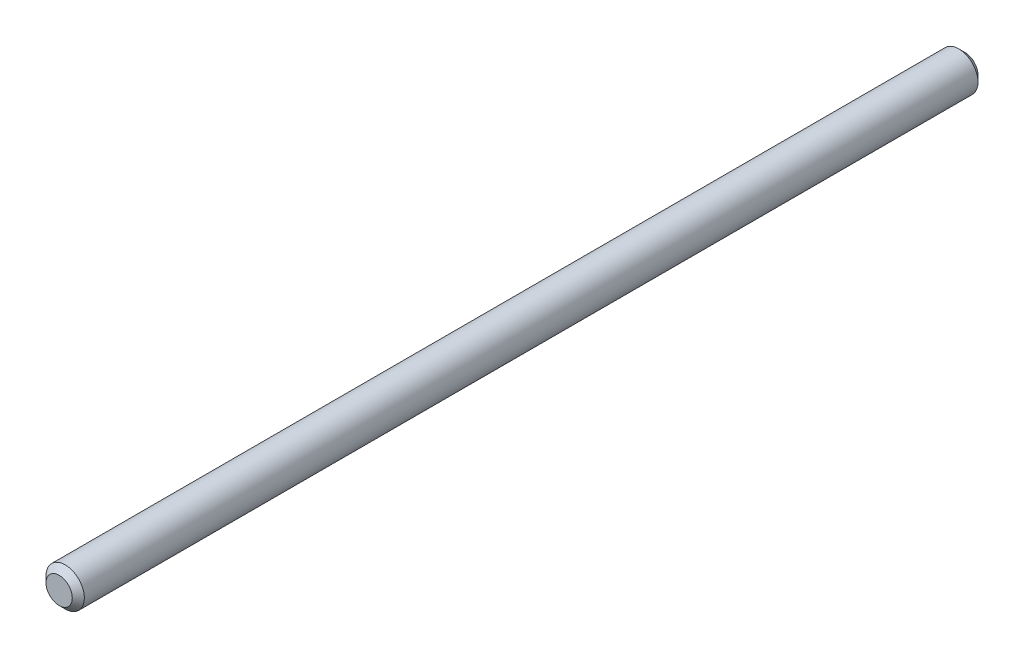
ISO-10303-21;
HEADER;
FILE_DESCRIPTION(('STEP AP214'),'2;1');
FILE_NAME('part.step','',(''),(''),'','','');
FILE_SCHEMA(('AUTOMOTIVE_DESIGN { 1 0 10303 214 1 1 1 1 }'));
ENDSEC;
DATA;
#1=APPLICATION_CONTEXT('core data for automotive mechanical design processes');
#2=APPLICATION_PROTOCOL_DEFINITION('international standard','automotive_design',2000,#1);
#3=PRODUCT_CONTEXT('',#1,'mechanical');
#4=PRODUCT('Part','Part','',(#3));
#5=PRODUCT_RELATED_PRODUCT_CATEGORY('part','',(#4));
#6=PRODUCT_DEFINITION_FORMATION('','',#4);
#7=PRODUCT_DEFINITION_CONTEXT('part definition',#1,'design');
#8=PRODUCT_DEFINITION('design','',#6,#7);
#9=PRODUCT_DEFINITION_SHAPE('','',#8);
#10=(LENGTH_UNIT() NAMED_UNIT(*) SI_UNIT(.MILLI.,.METRE.));
#11=(NAMED_UNIT(*) PLANE_ANGLE_UNIT() SI_UNIT($,.RADIAN.));
#12=(NAMED_UNIT(*) SI_UNIT($,.STERADIAN.) SOLID_ANGLE_UNIT());
#13=UNCERTAINTY_MEASURE_WITH_UNIT(LENGTH_MEASURE(1.E-05),#10,'distance_accuracy_value','');
#14=(GEOMETRIC_REPRESENTATION_CONTEXT(3) GLOBAL_UNCERTAINTY_ASSIGNED_CONTEXT((#13)) GLOBAL_UNIT_ASSIGNED_CONTEXT((#10,
#11,#12)) REPRESENTATION_CONTEXT('',''));
#15=CARTESIAN_POINT('',(0.,0.,0.));
#16=DIRECTION('',(0.,0.,1.));
#17=DIRECTION('',(1.,0.,0.));
#18=AXIS2_PLACEMENT_3D('',#15,#16,#17);
#19=CARTESIAN_POINT('',(0.,0.,75.));
#20=DIRECTION('',(0.,0.,-1.));
#21=DIRECTION('',(-1.,0.,0.));
#22=AXIS2_PLACEMENT_3D('',#19,#20,#21);
#23=CYLINDRICAL_SURFACE('',#22,3.175);
#24=CARTESIAN_POINT('',(0.,0.,-74.));
#25=DIRECTION('',(0.,0.,1.));
#26=DIRECTION('',(1.,0.,0.));
#27=AXIS2_PLACEMENT_3D('',#24,#25,#26);
#28=CIRCLE('',#27,3.175);
#29=CARTESIAN_POINT('',(3.175,0.,-74.));
#30=VERTEX_POINT('',#29);
#31=EDGE_CURVE('E43',#30,#30,#28,.T.);
#32=ORIENTED_EDGE('',*,*,#31,.T.);
#33=EDGE_LOOP('',(#32));
#34=FACE_BOUND('',#33,.T.);
#35=CARTESIAN_POINT('',(0.,0.,74.));
#36=DIRECTION('',(0.,0.,1.));
#37=DIRECTION('',(1.,0.,0.));
#38=AXIS2_PLACEMENT_3D('',#35,#36,#37);
#39=CIRCLE('',#38,3.175);
#40=CARTESIAN_POINT('',(3.175,0.,74.));
#41=VERTEX_POINT('',#40);
#42=EDGE_CURVE('E47',#41,#41,#39,.F.);
#43=ORIENTED_EDGE('',*,*,#42,.T.);
#44=EDGE_LOOP('',(#43));
#45=FACE_BOUND('',#44,.T.);
#46=ADVANCED_FACE('F32',(#34,#45),#23,.T.);
#47=CARTESIAN_POINT('',(0.,0.,75.));
#48=DIRECTION('',(0.,0.,1.));
#49=DIRECTION('',(1.,0.,0.));
#50=AXIS2_PLACEMENT_3D('',#47,#48,#49);
#51=PLANE('',#50);
#52=CARTESIAN_POINT('',(0.,0.,75.));
#53=DIRECTION('',(0.,0.,1.));
#54=DIRECTION('',(1.,0.,0.));
#55=AXIS2_PLACEMENT_3D('',#52,#53,#54);
#56=CIRCLE('',#55,2.17500000000001);
#57=CARTESIAN_POINT('',(2.17500000000001,0.,75.));
#58=VERTEX_POINT('',#57);
#59=EDGE_CURVE('E10',#58,#58,#56,.T.);
#60=ORIENTED_EDGE('',*,*,#59,.T.);
#61=EDGE_LOOP('',(#60));
#62=FACE_BOUND('',#61,.T.);
#63=ADVANCED_FACE('F63',(#62),#51,.T.);
#64=CARTESIAN_POINT('',(0.,0.,-75.));
#65=DIRECTION('',(0.,0.,1.));
#66=DIRECTION('',(1.,0.,0.));
#67=AXIS2_PLACEMENT_3D('',#64,#65,#66);
#68=PLANE('',#67);
#69=CARTESIAN_POINT('',(0.,0.,-75.));
#70=DIRECTION('',(0.,0.,1.));
#71=DIRECTION('',(1.,0.,0.));
#72=AXIS2_PLACEMENT_3D('',#69,#70,#71);
#73=CIRCLE('',#72,2.17499999999994);
#74=CARTESIAN_POINT('',(2.17499999999994,0.,-75.));
#75=VERTEX_POINT('',#74);
#76=EDGE_CURVE('E39',#75,#75,#73,.F.);
#77=ORIENTED_EDGE('',*,*,#76,.T.);
#78=EDGE_LOOP('',(#77));
#79=FACE_BOUND('',#78,.T.);
#80=ADVANCED_FACE('F60',(#79),#68,.F.);
#81=CARTESIAN_POINT('',(0.,0.,-74.));
#82=DIRECTION('',(0.,0.,1.));
#83=DIRECTION('',(1.,0.,0.));
#84=AXIS2_PLACEMENT_3D('',#81,#82,#83);
#85=CONICAL_SURFACE('',#84,3.175,0.785398163397464);
#86=ORIENTED_EDGE('',*,*,#76,.F.);
#87=EDGE_LOOP('',(#86));
#88=FACE_BOUND('',#87,.T.);
#89=ORIENTED_EDGE('',*,*,#31,.F.);
#90=EDGE_LOOP('',(#89));
#91=FACE_BOUND('',#90,.T.);
#92=ADVANCED_FACE('F56',(#88,#91),#85,.T.);
#93=CARTESIAN_POINT('',(0.,0.,75.));
#94=DIRECTION('',(0.,0.,-1.));
#95=DIRECTION('',(-1.,0.,0.));
#96=AXIS2_PLACEMENT_3D('',#93,#94,#95);
#97=CONICAL_SURFACE('',#96,2.17500000000001,0.785398163397443);
#98=ORIENTED_EDGE('',*,*,#42,.F.);
#99=EDGE_LOOP('',(#98));
#100=FACE_BOUND('',#99,.T.);
#101=ORIENTED_EDGE('',*,*,#59,.F.);
#102=EDGE_LOOP('',(#101));
#103=FACE_BOUND('',#102,.T.);
#104=ADVANCED_FACE('F34',(#100,#103),#97,.T.);
#105=CLOSED_SHELL('',(#46,#63,#80,#92,#104));
#106=MANIFOLD_SOLID_BREP('B2',#105);
#107=ADVANCED_BREP_SHAPE_REPRESENTATION('',(#18,#106),#14);
#108=SHAPE_DEFINITION_REPRESENTATION(#9,#107);
ENDSEC;
END-ISO-10303-21;
